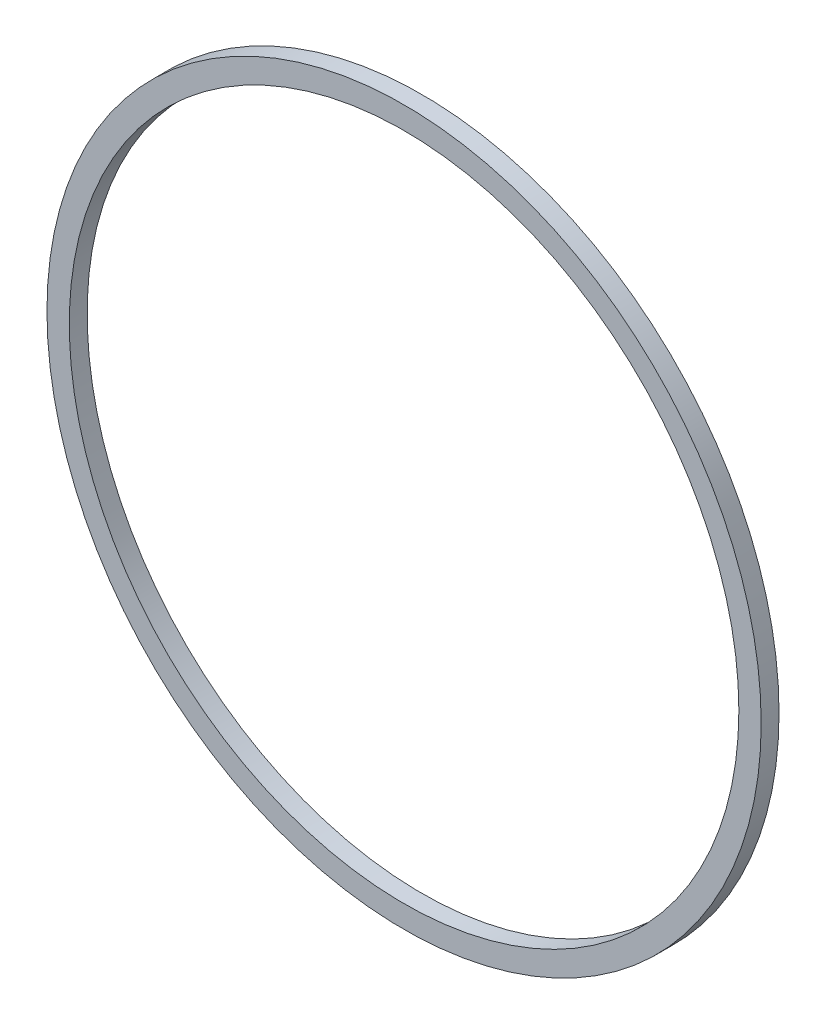
ISO-10303-21;
HEADER;
FILE_DESCRIPTION(('STEP AP214'),'2;1');
FILE_NAME('part.step','',(''),(''),'','','');
FILE_SCHEMA(('AUTOMOTIVE_DESIGN { 1 0 10303 214 1 1 1 1 }'));
ENDSEC;
DATA;
#1=APPLICATION_CONTEXT('core data for automotive mechanical design processes');
#2=APPLICATION_PROTOCOL_DEFINITION('international standard','automotive_design',2000,#1);
#3=PRODUCT_CONTEXT('',#1,'mechanical');
#4=PRODUCT('Part','Part','',(#3));
#5=PRODUCT_RELATED_PRODUCT_CATEGORY('part','',(#4));
#6=PRODUCT_DEFINITION_FORMATION('','',#4);
#7=PRODUCT_DEFINITION_CONTEXT('part definition',#1,'design');
#8=PRODUCT_DEFINITION('design','',#6,#7);
#9=PRODUCT_DEFINITION_SHAPE('','',#8);
#10=(LENGTH_UNIT() NAMED_UNIT(*) SI_UNIT(.MILLI.,.METRE.));
#11=(NAMED_UNIT(*) PLANE_ANGLE_UNIT() SI_UNIT($,.RADIAN.));
#12=(NAMED_UNIT(*) SI_UNIT($,.STERADIAN.) SOLID_ANGLE_UNIT());
#13=UNCERTAINTY_MEASURE_WITH_UNIT(LENGTH_MEASURE(1.E-05),#10,'distance_accuracy_value','');
#14=(GEOMETRIC_REPRESENTATION_CONTEXT(3) GLOBAL_UNCERTAINTY_ASSIGNED_CONTEXT((#13)) GLOBAL_UNIT_ASSIGNED_CONTEXT((#10,
#11,#12)) REPRESENTATION_CONTEXT('',''));
#15=CARTESIAN_POINT('',(0.,0.,0.));
#16=DIRECTION('',(0.,0.,1.));
#17=DIRECTION('',(1.,0.,0.));
#18=AXIS2_PLACEMENT_3D('',#15,#16,#17);
#19=CARTESIAN_POINT('',(0.,0.,2.));
#20=DIRECTION('',(0.,0.,1.));
#21=DIRECTION('',(1.,0.,0.));
#22=AXIS2_PLACEMENT_3D('',#19,#20,#21);
#23=PLANE('',#22);
#24=CARTESIAN_POINT('',(0.,0.,2.));
#25=DIRECTION('',(0.,0.,1.));
#26=DIRECTION('',(1.,0.,0.));
#27=AXIS2_PLACEMENT_3D('',#24,#25,#26);
#28=CIRCLE('',#27,40.);
#29=CARTESIAN_POINT('',(40.,0.,2.));
#30=VERTEX_POINT('',#29);
#31=EDGE_CURVE('E11',#30,#30,#28,.T.);
#32=ORIENTED_EDGE('',*,*,#31,.T.);
#33=EDGE_LOOP('',(#32));
#34=FACE_BOUND('',#33,.T.);
#35=CARTESIAN_POINT('',(0.,0.,2.));
#36=DIRECTION('',(0.,0.,1.));
#37=DIRECTION('',(1.,0.,0.));
#38=AXIS2_PLACEMENT_3D('',#35,#36,#37);
#39=CIRCLE('',#38,37.5);
#40=CARTESIAN_POINT('',(37.5,0.,2.));
#41=VERTEX_POINT('',#40);
#42=EDGE_CURVE('E49',#41,#41,#39,.T.);
#43=ORIENTED_EDGE('',*,*,#42,.F.);
#44=EDGE_LOOP('',(#43));
#45=FACE_BOUND('',#44,.T.);
#46=ADVANCED_FACE('F38',(#34,#45),#23,.T.);
#47=CARTESIAN_POINT('',(0.,0.,0.));
#48=DIRECTION('',(0.,0.,1.));
#49=DIRECTION('',(1.,0.,0.));
#50=AXIS2_PLACEMENT_3D('',#47,#48,#49);
#51=PLANE('',#50);
#52=CARTESIAN_POINT('',(0.,0.,0.));
#53=DIRECTION('',(0.,0.,1.));
#54=DIRECTION('',(1.,0.,0.));
#55=AXIS2_PLACEMENT_3D('',#52,#53,#54);
#56=CIRCLE('',#55,40.);
#57=CARTESIAN_POINT('',(40.,0.,0.));
#58=VERTEX_POINT('',#57);
#59=EDGE_CURVE('E42',#58,#58,#56,.T.);
#60=ORIENTED_EDGE('',*,*,#59,.F.);
#61=EDGE_LOOP('',(#60));
#62=FACE_BOUND('',#61,.T.);
#63=CARTESIAN_POINT('',(0.,0.,0.));
#64=DIRECTION('',(0.,0.,1.));
#65=DIRECTION('',(1.,0.,0.));
#66=AXIS2_PLACEMENT_3D('',#63,#64,#65);
#67=CIRCLE('',#66,37.5);
#68=CARTESIAN_POINT('',(37.5,0.,0.));
#69=VERTEX_POINT('',#68);
#70=EDGE_CURVE('E51',#69,#69,#67,.T.);
#71=ORIENTED_EDGE('',*,*,#70,.T.);
#72=EDGE_LOOP('',(#71));
#73=FACE_BOUND('',#72,.T.);
#74=ADVANCED_FACE('F61',(#62,#73),#51,.F.);
#75=CARTESIAN_POINT('',(0.,0.,2.));
#76=DIRECTION('',(0.,0.,-1.));
#77=DIRECTION('',(-1.,0.,0.));
#78=AXIS2_PLACEMENT_3D('',#75,#76,#77);
#79=CYLINDRICAL_SURFACE('',#78,40.);
#80=ORIENTED_EDGE('',*,*,#31,.F.);
#81=EDGE_LOOP('',(#80));
#82=FACE_BOUND('',#81,.T.);
#83=ORIENTED_EDGE('',*,*,#59,.T.);
#84=EDGE_LOOP('',(#83));
#85=FACE_BOUND('',#84,.T.);
#86=ADVANCED_FACE('F40',(#82,#85),#79,.T.);
#87=CARTESIAN_POINT('',(0.,0.,2.));
#88=DIRECTION('',(0.,0.,-1.));
#89=DIRECTION('',(-1.,0.,0.));
#90=AXIS2_PLACEMENT_3D('',#87,#88,#89);
#91=CYLINDRICAL_SURFACE('',#90,37.5);
#92=ORIENTED_EDGE('',*,*,#42,.T.);
#93=EDGE_LOOP('',(#92));
#94=FACE_BOUND('',#93,.T.);
#95=ORIENTED_EDGE('',*,*,#70,.F.);
#96=EDGE_LOOP('',(#95));
#97=FACE_BOUND('',#96,.T.);
#98=ADVANCED_FACE('F57',(#94,#97),#91,.F.);
#99=CLOSED_SHELL('',(#46,#74,#86,#98));
#100=MANIFOLD_SOLID_BREP('B2',#99);
#101=ADVANCED_BREP_SHAPE_REPRESENTATION('',(#18,#100),#14);
#102=SHAPE_DEFINITION_REPRESENTATION(#9,#101);
ENDSEC;
END-ISO-10303-21;
